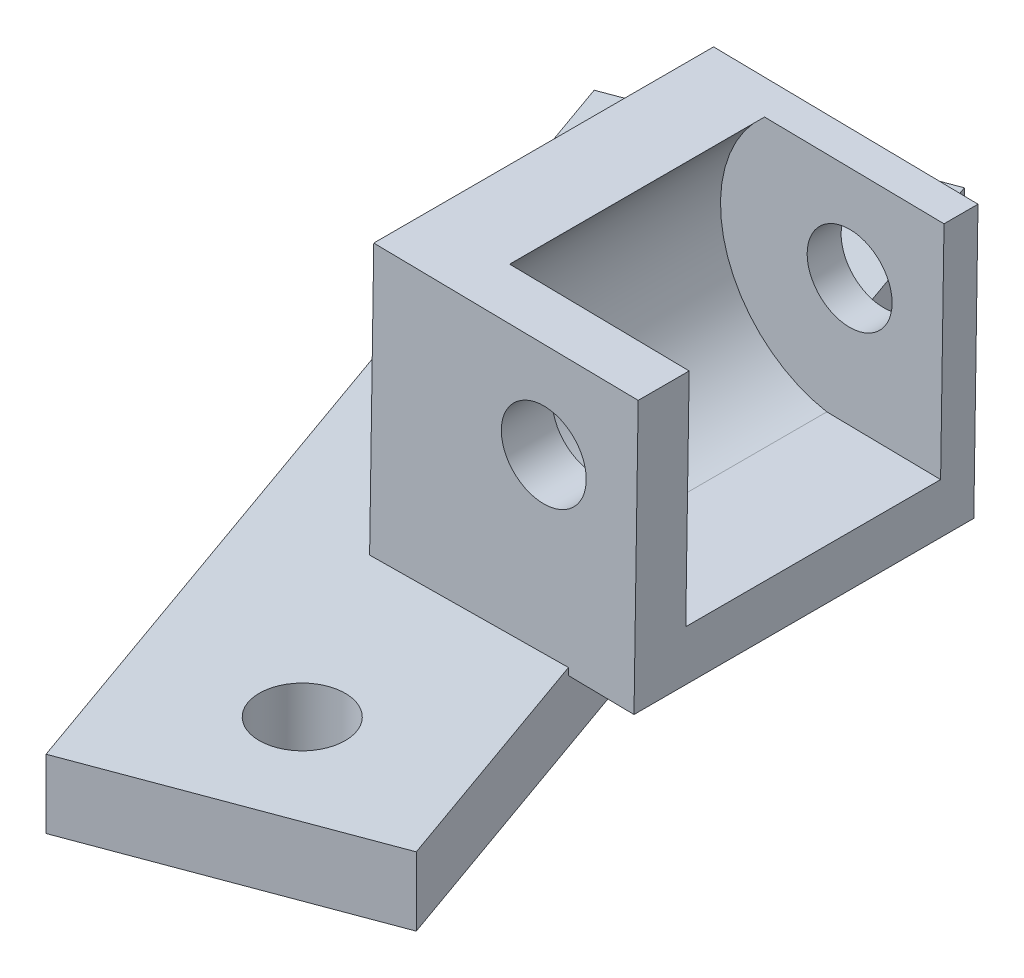
ISO-10303-21;
HEADER;
FILE_DESCRIPTION(('STEP AP214'),'2;1');
FILE_NAME('part.step','',(''),(''),'','','');
FILE_SCHEMA(('AUTOMOTIVE_DESIGN { 1 0 10303 214 1 1 1 1 }'));
ENDSEC;
DATA;
#1=APPLICATION_CONTEXT('core data for automotive mechanical design processes');
#2=APPLICATION_PROTOCOL_DEFINITION('international standard','automotive_design',2000,#1);
#3=PRODUCT_CONTEXT('',#1,'mechanical');
#4=PRODUCT('Part','Part','',(#3));
#5=PRODUCT_RELATED_PRODUCT_CATEGORY('part','',(#4));
#6=PRODUCT_DEFINITION_FORMATION('','',#4);
#7=PRODUCT_DEFINITION_CONTEXT('part definition',#1,'design');
#8=PRODUCT_DEFINITION('design','',#6,#7);
#9=PRODUCT_DEFINITION_SHAPE('','',#8);
#10=(LENGTH_UNIT() NAMED_UNIT(*) SI_UNIT(.MILLI.,.METRE.));
#11=(NAMED_UNIT(*) PLANE_ANGLE_UNIT() SI_UNIT($,.RADIAN.));
#12=(NAMED_UNIT(*) SI_UNIT($,.STERADIAN.) SOLID_ANGLE_UNIT());
#13=UNCERTAINTY_MEASURE_WITH_UNIT(LENGTH_MEASURE(1.E-05),#10,'distance_accuracy_value','');
#14=(GEOMETRIC_REPRESENTATION_CONTEXT(3) GLOBAL_UNCERTAINTY_ASSIGNED_CONTEXT((#13)) GLOBAL_UNIT_ASSIGNED_CONTEXT((#10,
#11,#12)) REPRESENTATION_CONTEXT('',''));
#15=CARTESIAN_POINT('',(0.,0.,0.));
#16=DIRECTION('',(0.,0.,1.));
#17=DIRECTION('',(1.,0.,0.));
#18=AXIS2_PLACEMENT_3D('',#15,#16,#17);
#19=CARTESIAN_POINT('',(1.23244160219368,80.7225949257512,-21.59));
#20=DIRECTION('',(0.0152658371215677,0.999883470318906,0.));
#21=DIRECTION('',(-0.999883470318906,0.0152658371215677,0.));
#22=AXIS2_PLACEMENT_3D('',#19,#20,#21);
#23=PLANE('',#22);
#24=DIRECTION('',(-0.999883470318906,0.0152658371215677,0.));
#25=VECTOR('',#24,1.);
#26=CARTESIAN_POINT('',(-621.150306901994,90.224895891791,3.81));
#27=LINE('',#26,#25);
#28=CARTESIAN_POINT('',(-621.150306901994,90.224895891791,3.81));
#29=VERTEX_POINT('',#28);
#30=CARTESIAN_POINT('',(-626.045001013298,90.2996262031534,3.81));
#31=VERTEX_POINT('',#30);
#32=EDGE_CURVE('E232',#29,#31,#27,.T.);
#33=ORIENTED_EDGE('',*,*,#32,.T.);
#34=DIRECTION('',(-0.342298929272063,0.00522608869560341,-0.939576570065551));
#35=VECTOR('',#34,1.);
#36=CARTESIAN_POINT('',(-560.699723801131,89.3019595867962,183.17629706543));
#37=LINE('',#36,#35);
#38=CARTESIAN_POINT('',(-635.298523376999,90.4409054315819,-21.59));
#39=VERTEX_POINT('',#38);
#40=EDGE_CURVE('E219',#31,#39,#37,.T.);
#41=ORIENTED_EDGE('',*,*,#40,.T.);
#42=DIRECTION('',(-0.999883470318906,0.0152658371215677,0.));
#43=VECTOR('',#42,1.);
#44=CARTESIAN_POINT('',(1.23244160219368,80.7225949257512,-21.59));
#45=LINE('',#44,#43);
#46=CARTESIAN_POINT('',(-621.150306901994,90.224895891791,-21.59));
#47=VERTEX_POINT('',#46);
#48=EDGE_CURVE('E274',#47,#39,#45,.T.);
#49=ORIENTED_EDGE('',*,*,#48,.F.);
#50=DIRECTION('',(0.,0.,1.));
#51=VECTOR('',#50,1.);
#52=CARTESIAN_POINT('',(-621.150306901994,90.224895891791,-21.59));
#53=LINE('',#52,#51);
#54=EDGE_CURVE('E287',#47,#29,#53,.T.);
#55=ORIENTED_EDGE('',*,*,#54,.T.);
#56=EDGE_LOOP('',(#33,#41,#49,#55));
#57=FACE_BOUND('',#56,.T.);
#58=ADVANCED_FACE('F56',(#57),#23,.F.);
#59=CARTESIAN_POINT('',(-627.893070479448,103.664395922966,-21.59));
#60=DIRECTION('',(0.,0.,1.));
#61=DIRECTION('',(1.,0.,0.));
#62=AXIS2_PLACEMENT_3D('',#59,#60,#61);
#63=CYLINDRICAL_SURFACE('',#62,9.65200000000006);
#64=CARTESIAN_POINT('',(-627.893070479448,103.664395922966,-19.0499999999996));
#65=DIRECTION('',(0.,0.,-1.));
#66=DIRECTION('',(-1.,0.,0.));
#67=AXIS2_PLACEMENT_3D('',#64,#65,#66);
#68=CIRCLE('',#67,9.65200000000008);
#69=CARTESIAN_POINT('',(-629.598897848948,94.164329766067,-19.0499999999997));
#70=VERTEX_POINT('',#69);
#71=CARTESIAN_POINT('',(-634.25254540357,110.925124721748,-19.0499999999998));
#72=VERTEX_POINT('',#71);
#73=EDGE_CURVE('E254',#70,#72,#68,.T.);
#74=ORIENTED_EDGE('',*,*,#73,.T.);
#75=DIRECTION('',(0.,0.,1.));
#76=VECTOR('',#75,1.);
#77=CARTESIAN_POINT('',(-634.25254540357,110.925124721748,-21.59));
#78=LINE('',#77,#76);
#79=CARTESIAN_POINT('',(-634.25254540357,110.925124721748,0.));
#80=VERTEX_POINT('',#79);
#81=EDGE_CURVE('E279',#72,#80,#78,.T.);
#82=ORIENTED_EDGE('',*,*,#81,.T.);
#83=CARTESIAN_POINT('',(-627.893070479448,103.664395922966,0.));
#84=DIRECTION('',(0.,0.,1.));
#85=DIRECTION('',(1.,0.,0.));
#86=AXIS2_PLACEMENT_3D('',#83,#84,#85);
#87=CIRCLE('',#86,9.65200000000006);
#88=CARTESIAN_POINT('',(-629.598897848948,94.164329766067,0.));
#89=VERTEX_POINT('',#88);
#90=EDGE_CURVE('E267',#80,#89,#87,.T.);
#91=ORIENTED_EDGE('',*,*,#90,.T.);
#92=DIRECTION('',(0.,0.,1.));
#93=VECTOR('',#92,1.);
#94=CARTESIAN_POINT('',(-629.598897848948,94.164329766067,-21.59));
#95=LINE('',#94,#93);
#96=EDGE_CURVE('E283',#70,#89,#95,.T.);
#97=ORIENTED_EDGE('',*,*,#96,.F.);
#98=EDGE_LOOP('',(#74,#82,#91,#97));
#99=FACE_BOUND('',#98,.T.);
#100=ADVANCED_FACE('F58',(#99),#63,.F.);
#101=CARTESIAN_POINT('',(1.29060444162685,84.5321509476663,-21.59));
#102=DIRECTION('',(0.0152658371215677,0.999883470318906,0.));
#103=DIRECTION('',(-0.999883470318906,0.0152658371215677,0.));
#104=AXIS2_PLACEMENT_3D('',#101,#102,#103);
#105=PLANE('',#104);
#106=DIRECTION('',(0.,0.,1.));
#107=VECTOR('',#106,1.);
#108=CARTESIAN_POINT('',(-621.092144062561,94.0344519137061,-21.59));
#109=LINE('',#108,#107);
#110=CARTESIAN_POINT('',(-621.092144062561,94.0344519137061,-19.0499999999996));
#111=VERTEX_POINT('',#110);
#112=CARTESIAN_POINT('',(-621.092144062561,94.0344519137061,0.));
#113=VERTEX_POINT('',#112);
#114=EDGE_CURVE('E285',#111,#113,#109,.T.);
#115=ORIENTED_EDGE('',*,*,#114,.F.);
#116=DIRECTION('',(-0.999883470318906,0.0152658371215695,0.));
#117=VECTOR('',#116,1.);
#118=CARTESIAN_POINT('',(1.29060444162699,84.5321509476652,-19.05));
#119=LINE('',#118,#117);
#120=EDGE_CURVE('E79',#111,#70,#119,.T.);
#121=ORIENTED_EDGE('',*,*,#120,.T.);
#122=ORIENTED_EDGE('',*,*,#96,.T.);
#123=DIRECTION('',(-0.999883470318906,0.0152658371215677,0.));
#124=VECTOR('',#123,1.);
#125=CARTESIAN_POINT('',(1.29060444162685,84.5321509476663,0.));
#126=LINE('',#125,#124);
#127=EDGE_CURVE('E271',#113,#89,#126,.T.);
#128=ORIENTED_EDGE('',*,*,#127,.F.);
#129=EDGE_LOOP('',(#115,#121,#122,#128));
#130=FACE_BOUND('',#129,.T.);
#131=ADVANCED_FACE('F340',(#130),#105,.T.);
#132=CARTESIAN_POINT('',(-622.382748504188,9.50230096603983,-21.59));
#133=DIRECTION('',(-0.999883470318906,0.0152658371215677,0.));
#134=DIRECTION('',(-0.0152658371215678,-0.999883470318906,0.));
#135=AXIS2_PLACEMENT_3D('',#132,#133,#134);
#136=PLANE('',#135);
#137=ORIENTED_EDGE('',*,*,#114,.T.);
#138=DIRECTION('',(-0.0152658371215623,-0.999883470318906,0.));
#139=VECTOR('',#138,1.);
#140=CARTESIAN_POINT('',(-620.837390825843,110.720307289694,0.));
#141=LINE('',#140,#139);
#142=CARTESIAN_POINT('',(-620.837390825843,110.720307289694,0.));
#143=VERTEX_POINT('',#142);
#144=EDGE_CURVE('E236',#143,#113,#141,.T.);
#145=ORIENTED_EDGE('',*,*,#144,.F.);
#146=DIRECTION('',(0.,0.,-1.));
#147=VECTOR('',#146,1.);
#148=CARTESIAN_POINT('',(-620.837390825843,110.720307289694,3.81));
#149=LINE('',#148,#147);
#150=CARTESIAN_POINT('',(-620.837390825843,110.720307289694,3.81));
#151=VERTEX_POINT('',#150);
#152=EDGE_CURVE('E244',#151,#143,#149,.T.);
#153=ORIENTED_EDGE('',*,*,#152,.F.);
#154=DIRECTION('',(-0.0152658371215623,-0.999883470318906,0.));
#155=VECTOR('',#154,1.);
#156=CARTESIAN_POINT('',(-620.837390825843,110.720307289694,3.81));
#157=LINE('',#156,#155);
#158=EDGE_CURVE('E241',#151,#29,#157,.T.);
#159=ORIENTED_EDGE('',*,*,#158,.T.);
#160=ORIENTED_EDGE('',*,*,#54,.F.);
#161=DIRECTION('',(-0.0152658371215678,-0.999883470318906,0.));
#162=VECTOR('',#161,1.);
#163=CARTESIAN_POINT('',(-622.382748504188,9.50230096603983,-21.59));
#164=LINE('',#163,#162);
#165=CARTESIAN_POINT('',(-620.837390825843,110.720307289694,-21.59));
#166=VERTEX_POINT('',#165);
#167=EDGE_CURVE('E277',#166,#47,#164,.T.);
#168=ORIENTED_EDGE('',*,*,#167,.F.);
#169=DIRECTION('',(0.,0.,1.));
#170=VECTOR('',#169,1.);
#171=CARTESIAN_POINT('',(-620.837390825843,110.720307289694,-45.3479752360297));
#172=LINE('',#171,#170);
#173=CARTESIAN_POINT('',(-620.837390825843,110.720307289694,-19.0499999999998));
#174=VERTEX_POINT('',#173);
#175=EDGE_CURVE('E262',#166,#174,#172,.T.);
#176=ORIENTED_EDGE('',*,*,#175,.T.);
#177=DIRECTION('',(0.0152658371215684,0.999883470318906,0.));
#178=VECTOR('',#177,1.);
#179=CARTESIAN_POINT('',(-622.382748504188,9.50230096604021,-19.0499999999996));
#180=LINE('',#179,#178);
#181=EDGE_CURVE('E250',#111,#174,#180,.T.);
#182=ORIENTED_EDGE('',*,*,#181,.F.);
#183=EDGE_LOOP('',(#137,#145,#153,#159,#160,#168,#176,#182));
#184=FACE_BOUND('',#183,.T.);
#185=ADVANCED_FACE('F322',(#184),#136,.F.);
#186=CARTESIAN_POINT('',(-635.371075882775,90.4420131353982,-21.5899999999999));
#187=VERTEX_POINT('',#186);
#188=CARTESIAN_POINT('',(-640.914721516246,90.5266513895672,-21.59));
#189=VERTEX_POINT('',#188);
#190=EDGE_CURVE('E273',#187,#189,#45,.T.);
#191=ORIENTED_EDGE('',*,*,#190,.F.);
#192=DIRECTION('',(-0.400047773889427,0.0061077758942189,0.916473935079302));
#193=VECTOR('',#192,1.);
#194=CARTESIAN_POINT('',(-533.46643276404,88.8861721499623,-255.044490632144));
#195=LINE('',#194,#193);
#196=CARTESIAN_POINT('',(-640.914721516246,90.5266513895672,-8.89000000001022));
#197=VERTEX_POINT('',#196);
#198=EDGE_CURVE('E213',#187,#197,#195,.T.);
#199=ORIENTED_EDGE('',*,*,#198,.T.);
#200=DIRECTION('',(0.,0.,1.));
#201=VECTOR('',#200,1.);
#202=CARTESIAN_POINT('',(-640.914721516246,90.5266513895672,-21.59));
#203=LINE('',#202,#201);
#204=EDGE_CURVE('E289',#189,#197,#203,.T.);
#205=ORIENTED_EDGE('',*,*,#204,.F.);
#206=EDGE_LOOP('',(#191,#199,#205));
#207=FACE_BOUND('',#206,.T.);
#208=ADVANCED_FACE('F310',(#207),#23,.F.);
#209=CARTESIAN_POINT('',(-642.147163118439,9.80405646381606,-21.59));
#210=DIRECTION('',(0.999883470318906,-0.0152658371215678,0.));
#211=DIRECTION('',(0.0152658371215678,0.999883470318906,0.));
#212=AXIS2_PLACEMENT_3D('',#209,#210,#211);
#213=PLANE('',#212);
#214=ORIENTED_EDGE('',*,*,#204,.T.);
#215=DIRECTION('',(0.000170947301251259,0.0111967250440051,0.999937300097016));
#216=VECTOR('',#215,1.);
#217=CARTESIAN_POINT('',(-640.917046953941,90.3743396169369,-22.4923901719979));
#218=LINE('',#217,#216);
#219=CARTESIAN_POINT('',(-640.912550349388,90.6688587140116,3.81));
#220=VERTEX_POINT('',#219);
#221=EDGE_CURVE('E207',#197,#220,#218,.T.);
#222=ORIENTED_EDGE('',*,*,#221,.T.);
#223=DIRECTION('',(0.0152658371215677,0.999883470318906,0.));
#224=VECTOR('',#223,1.);
#225=CARTESIAN_POINT('',(-640.914721516246,90.5266513895672,3.81));
#226=LINE('',#225,#224);
#227=CARTESIAN_POINT('',(-640.601805440095,111.02206278747,3.81));
#228=VERTEX_POINT('',#227);
#229=EDGE_CURVE('E235',#220,#228,#226,.T.);
#230=ORIENTED_EDGE('',*,*,#229,.T.);
#231=DIRECTION('',(0.,0.,1.));
#232=VECTOR('',#231,1.);
#233=CARTESIAN_POINT('',(-640.601805440095,111.02206278747,-21.59));
#234=LINE('',#233,#232);
#235=CARTESIAN_POINT('',(-640.601805440095,111.02206278747,-21.59));
#236=VERTEX_POINT('',#235);
#237=EDGE_CURVE('E292',#236,#228,#234,.T.);
#238=ORIENTED_EDGE('',*,*,#237,.F.);
#239=DIRECTION('',(0.0152658371215678,0.999883470318906,0.));
#240=VECTOR('',#239,1.);
#241=CARTESIAN_POINT('',(-642.147163118439,9.80405646381606,-21.59));
#242=LINE('',#241,#240);
#243=EDGE_CURVE('E270',#189,#236,#242,.T.);
#244=ORIENTED_EDGE('',*,*,#243,.F.);
#245=EDGE_LOOP('',(#214,#222,#230,#238,#244));
#246=FACE_BOUND('',#245,.T.);
#247=ADVANCED_FACE('F304',(#246),#213,.F.);
#248=CARTESIAN_POINT('',(1.54535767834408,101.218006323655,-21.59));
#249=DIRECTION('',(-0.015265837121567,-0.999883470318906,0.));
#250=DIRECTION('',(0.999883470318906,-0.015265837121567,0.));
#251=AXIS2_PLACEMENT_3D('',#248,#249,#250);
#252=PLANE('',#251);
#253=ORIENTED_EDGE('',*,*,#237,.T.);
#254=DIRECTION('',(0.999883470318906,-0.0152658371215671,0.));
#255=VECTOR('',#254,1.);
#256=CARTESIAN_POINT('',(-640.601805440095,111.02206278747,3.81));
#257=LINE('',#256,#255);
#258=EDGE_CURVE('E238',#228,#151,#257,.T.);
#259=ORIENTED_EDGE('',*,*,#258,.T.);
#260=ORIENTED_EDGE('',*,*,#152,.T.);
#261=DIRECTION('',(0.999883470318906,-0.0152658371215671,0.));
#262=VECTOR('',#261,1.);
#263=CARTESIAN_POINT('',(-640.601805440095,111.02206278747,0.));
#264=LINE('',#263,#262);
#265=EDGE_CURVE('E229',#80,#143,#264,.T.);
#266=ORIENTED_EDGE('',*,*,#265,.F.);
#267=ORIENTED_EDGE('',*,*,#81,.F.);
#268=DIRECTION('',(0.999883470318906,-0.0152658371215682,0.));
#269=VECTOR('',#268,1.);
#270=CARTESIAN_POINT('',(1.54535767834418,101.218006323654,-19.0499999999998));
#271=LINE('',#270,#269);
#272=EDGE_CURVE('E256',#72,#174,#271,.T.);
#273=ORIENTED_EDGE('',*,*,#272,.T.);
#274=ORIENTED_EDGE('',*,*,#175,.F.);
#275=DIRECTION('',(0.999883470318906,-0.015265837121567,0.));
#276=VECTOR('',#275,1.);
#277=CARTESIAN_POINT('',(1.54535767834408,101.218006323655,-21.59));
#278=LINE('',#277,#276);
#279=EDGE_CURVE('E268',#236,#166,#278,.T.);
#280=ORIENTED_EDGE('',*,*,#279,.F.);
#281=EDGE_LOOP('',(#253,#259,#260,#266,#267,#273,#274,#280));
#282=FACE_BOUND('',#281,.T.);
#283=ADVANCED_FACE('F327',(#282),#252,.F.);
#284=CARTESIAN_POINT('',(0.,0.,-21.59));
#285=DIRECTION('',(0.,0.,1.));
#286=DIRECTION('',(1.,0.,0.));
#287=AXIS2_PLACEMENT_3D('',#284,#285,#286);
#288=PLANE('',#287);
#289=ORIENTED_EDGE('',*,*,#48,.T.);
#290=DIRECTION('',(-0.00630218747604839,0.999980141019319,0.));
#291=VECTOR('',#290,1.);
#292=CARTESIAN_POINT('',(-634.703326642942,-4.00009879406007,-21.59));
#293=LINE('',#292,#291);
#294=CARTESIAN_POINT('',(-635.298535103855,90.4427661543582,-21.59));
#295=VERTEX_POINT('',#294);
#296=EDGE_CURVE('E222',#39,#295,#293,.T.);
#297=ORIENTED_EDGE('',*,*,#296,.T.);
#298=DIRECTION('',(-0.999946125618088,-0.0103800703935442,0.));
#299=VECTOR('',#298,1.);
#300=CARTESIAN_POINT('',(-1.00720248977156,97.0271095643389,-21.59));
#301=LINE('',#300,#299);
#302=EDGE_CURVE('E216',#295,#187,#301,.T.);
#303=ORIENTED_EDGE('',*,*,#302,.T.);
#304=ORIENTED_EDGE('',*,*,#190,.T.);
#305=ORIENTED_EDGE('',*,*,#243,.T.);
#306=ORIENTED_EDGE('',*,*,#279,.T.);
#307=ORIENTED_EDGE('',*,*,#167,.T.);
#308=EDGE_LOOP('',(#289,#297,#303,#304,#305,#306,#307));
#309=FACE_BOUND('',#308,.T.);
#310=CARTESIAN_POINT('',(-627.893070479448,103.664395922966,-21.59));
#311=DIRECTION('',(0.,0.,1.));
#312=DIRECTION('',(1.,0.,0.));
#313=AXIS2_PLACEMENT_3D('',#310,#311,#312);
#314=CIRCLE('',#313,3.17500000000009);
#315=CARTESIAN_POINT('',(-624.718070479448,103.664395922966,-21.59));
#316=VERTEX_POINT('',#315);
#317=EDGE_CURVE('E264',#316,#316,#314,.F.);
#318=ORIENTED_EDGE('',*,*,#317,.F.);
#319=EDGE_LOOP('',(#318));
#320=FACE_BOUND('',#319,.T.);
#321=ADVANCED_FACE('F313',(#309,#320),#288,.F.);
#322=CARTESIAN_POINT('',(1.11022302462516E-13,0.,-19.0499999999998));
#323=DIRECTION('',(0.,0.,-1.));
#324=DIRECTION('',(-1.,0.,0.));
#325=AXIS2_PLACEMENT_3D('',#322,#323,#324);
#326=PLANE('',#325);
#327=ORIENTED_EDGE('',*,*,#181,.T.);
#328=ORIENTED_EDGE('',*,*,#272,.F.);
#329=ORIENTED_EDGE('',*,*,#73,.F.);
#330=ORIENTED_EDGE('',*,*,#120,.F.);
#331=EDGE_LOOP('',(#327,#328,#329,#330));
#332=FACE_BOUND('',#331,.T.);
#333=CARTESIAN_POINT('',(-627.893070479448,103.664395922966,-19.0499999999996));
#334=DIRECTION('',(0.,0.,-1.));
#335=DIRECTION('',(-1.,0.,0.));
#336=AXIS2_PLACEMENT_3D('',#333,#334,#335);
#337=CIRCLE('',#336,3.17500000000009);
#338=CARTESIAN_POINT('',(-631.068070479448,103.664395922966,-19.0499999999996));
#339=VERTEX_POINT('',#338);
#340=EDGE_CURVE('E259',#339,#339,#337,.F.);
#341=ORIENTED_EDGE('',*,*,#340,.F.);
#342=EDGE_LOOP('',(#341));
#343=FACE_BOUND('',#342,.T.);
#344=ADVANCED_FACE('F335',(#332,#343),#326,.F.);
#345=CARTESIAN_POINT('',(-627.893070479448,103.664395922966,-45.3479752360294));
#346=DIRECTION('',(0.,0.,1.));
#347=DIRECTION('',(1.,0.,0.));
#348=AXIS2_PLACEMENT_3D('',#345,#346,#347);
#349=CYLINDRICAL_SURFACE('',#348,3.17500000000009);
#350=ORIENTED_EDGE('',*,*,#317,.T.);
#351=EDGE_LOOP('',(#350));
#352=FACE_BOUND('',#351,.T.);
#353=ORIENTED_EDGE('',*,*,#340,.T.);
#354=EDGE_LOOP('',(#353));
#355=FACE_BOUND('',#354,.T.);
#356=ADVANCED_FACE('F344',(#352,#355),#349,.F.);
#357=CARTESIAN_POINT('',(0.,0.,0.));
#358=DIRECTION('',(0.,0.,-1.));
#359=DIRECTION('',(-1.,0.,0.));
#360=AXIS2_PLACEMENT_3D('',#357,#358,#359);
#361=PLANE('',#360);
#362=CARTESIAN_POINT('',(-627.893070479448,103.664395922966,0.));
#363=DIRECTION('',(0.,0.,1.));
#364=DIRECTION('',(1.,0.,0.));
#365=AXIS2_PLACEMENT_3D('',#362,#363,#364);
#366=CIRCLE('',#365,3.17500000000008);
#367=CARTESIAN_POINT('',(-631.068070479448,103.664395922966,0.));
#368=VERTEX_POINT('',#367);
#369=EDGE_CURVE('E225',#368,#368,#366,.T.);
#370=ORIENTED_EDGE('',*,*,#369,.T.);
#371=EDGE_LOOP('',(#370));
#372=FACE_BOUND('',#371,.T.);
#373=ORIENTED_EDGE('',*,*,#90,.F.);
#374=ORIENTED_EDGE('',*,*,#265,.T.);
#375=ORIENTED_EDGE('',*,*,#144,.T.);
#376=ORIENTED_EDGE('',*,*,#127,.T.);
#377=EDGE_LOOP('',(#373,#374,#375,#376));
#378=FACE_BOUND('',#377,.T.);
#379=ADVANCED_FACE('F342',(#372,#378),#361,.T.);
#380=CARTESIAN_POINT('',(0.,0.,3.81));
#381=DIRECTION('',(0.,0.,-1.));
#382=DIRECTION('',(-1.,0.,0.));
#383=AXIS2_PLACEMENT_3D('',#380,#381,#382);
#384=PLANE('',#383);
#385=DIRECTION('',(0.999946125618088,0.0103800703935442,0.));
#386=VECTOR('',#385,1.);
#387=CARTESIAN_POINT('',(-1.01015410692917,97.3114484974249,3.81));
#388=LINE('',#387,#386);
#389=CARTESIAN_POINT('',(-626.048300480575,90.823158986829,3.81000000000002));
#390=VERTEX_POINT('',#389);
#391=EDGE_CURVE('E64',#220,#390,#388,.T.);
#392=ORIENTED_EDGE('',*,*,#391,.T.);
#393=DIRECTION('',(0.00630218747604839,-0.999980141019319,0.));
#394=VECTOR('',#393,1.);
#395=CARTESIAN_POINT('',(-625.451062157138,-3.94178813070222,3.81));
#396=LINE('',#395,#394);
#397=EDGE_CURVE('E12',#390,#31,#396,.T.);
#398=ORIENTED_EDGE('',*,*,#397,.T.);
#399=ORIENTED_EDGE('',*,*,#32,.F.);
#400=ORIENTED_EDGE('',*,*,#158,.F.);
#401=ORIENTED_EDGE('',*,*,#258,.F.);
#402=ORIENTED_EDGE('',*,*,#229,.F.);
#403=EDGE_LOOP('',(#392,#398,#399,#400,#401,#402));
#404=FACE_BOUND('',#403,.T.);
#405=CARTESIAN_POINT('',(-627.893070479448,103.664395922966,3.81));
#406=DIRECTION('',(0.,0.,1.));
#407=DIRECTION('',(1.,0.,0.));
#408=AXIS2_PLACEMENT_3D('',#405,#406,#407);
#409=CIRCLE('',#408,3.17500000000008);
#410=CARTESIAN_POINT('',(-631.068070479448,103.664395922966,3.81));
#411=VERTEX_POINT('',#410);
#412=EDGE_CURVE('E226',#411,#411,#409,.T.);
#413=ORIENTED_EDGE('',*,*,#412,.F.);
#414=EDGE_LOOP('',(#413));
#415=FACE_BOUND('',#414,.T.);
#416=ADVANCED_FACE('F298',(#404,#415),#384,.F.);
#417=CARTESIAN_POINT('',(-627.893070479448,103.664395922966,3.81));
#418=DIRECTION('',(0.,0.,-1.));
#419=DIRECTION('',(-1.,0.,0.));
#420=AXIS2_PLACEMENT_3D('',#417,#418,#419);
#421=CYLINDRICAL_SURFACE('',#420,3.17500000000008);
#422=CARTESIAN_POINT('',(-631.068070479448,103.664395922966,3.81));
#423=CARTESIAN_POINT('',(-631.068070479448,103.664395922966,3.7703125));
#424=CARTESIAN_POINT('',(-631.068070479448,103.664395922966,3.730625));
#425=CARTESIAN_POINT('',(-631.068070479448,103.664395922966,3.65125));
#426=CARTESIAN_POINT('',(-631.068070479448,103.664395922966,3.6115625));
#427=CARTESIAN_POINT('',(-631.068070479448,103.664395922966,3.5321875));
#428=CARTESIAN_POINT('',(-631.068070479448,103.664395922966,3.4925));
#429=CARTESIAN_POINT('',(-631.068070479448,103.664395922966,3.413125));
#430=CARTESIAN_POINT('',(-631.068070479448,103.664395922966,3.3734375));
#431=CARTESIAN_POINT('',(-631.068070479448,103.664395922966,3.2940625));
#432=CARTESIAN_POINT('',(-631.068070479448,103.664395922966,3.254375));
#433=CARTESIAN_POINT('',(-631.068070479448,103.664395922966,3.175));
#434=CARTESIAN_POINT('',(-631.068070479448,103.664395922966,3.1353125));
#435=CARTESIAN_POINT('',(-631.068070479448,103.664395922966,3.0559375));
#436=CARTESIAN_POINT('',(-631.068070479448,103.664395922966,3.01625));
#437=CARTESIAN_POINT('',(-631.068070479448,103.664395922966,2.936875));
#438=CARTESIAN_POINT('',(-631.068070479448,103.664395922966,2.8971875));
#439=CARTESIAN_POINT('',(-631.068070479448,103.664395922966,2.8178125));
#440=CARTESIAN_POINT('',(-631.068070479448,103.664395922966,2.778125));
#441=CARTESIAN_POINT('',(-631.068070479448,103.664395922966,2.69875));
#442=CARTESIAN_POINT('',(-631.068070479448,103.664395922966,2.6590625));
#443=CARTESIAN_POINT('',(-631.068070479448,103.664395922966,2.5796875));
#444=CARTESIAN_POINT('',(-631.068070479448,103.664395922966,2.54));
#445=CARTESIAN_POINT('',(-631.068070479448,103.664395922966,2.460625));
#446=CARTESIAN_POINT('',(-631.068070479448,103.664395922966,2.4209375));
#447=CARTESIAN_POINT('',(-631.068070479448,103.664395922966,2.3415625));
#448=CARTESIAN_POINT('',(-631.068070479448,103.664395922966,2.301875));
#449=CARTESIAN_POINT('',(-631.068070479448,103.664395922966,2.2225));
#450=CARTESIAN_POINT('',(-631.068070479448,103.664395922966,2.1828125));
#451=CARTESIAN_POINT('',(-631.068070479448,103.664395922966,2.1034375));
#452=CARTESIAN_POINT('',(-631.068070479448,103.664395922966,2.06375));
#453=CARTESIAN_POINT('',(-631.068070479448,103.664395922966,1.984375));
#454=CARTESIAN_POINT('',(-631.068070479448,103.664395922966,1.9446875));
#455=CARTESIAN_POINT('',(-631.068070479448,103.664395922966,1.8653125));
#456=CARTESIAN_POINT('',(-631.068070479448,103.664395922966,1.825625));
#457=CARTESIAN_POINT('',(-631.068070479448,103.664395922966,1.74625));
#458=CARTESIAN_POINT('',(-631.068070479448,103.664395922966,1.7065625));
#459=CARTESIAN_POINT('',(-631.068070479448,103.664395922966,1.6271875));
#460=CARTESIAN_POINT('',(-631.068070479448,103.664395922966,1.5875));
#461=CARTESIAN_POINT('',(-631.068070479448,103.664395922966,1.508125));
#462=CARTESIAN_POINT('',(-631.068070479448,103.664395922966,1.4684375));
#463=CARTESIAN_POINT('',(-631.068070479448,103.664395922966,1.3890625));
#464=CARTESIAN_POINT('',(-631.068070479448,103.664395922966,1.349375));
#465=CARTESIAN_POINT('',(-631.068070479448,103.664395922966,1.27));
#466=CARTESIAN_POINT('',(-631.068070479448,103.664395922966,1.2303125));
#467=CARTESIAN_POINT('',(-631.068070479448,103.664395922966,1.1509375));
#468=CARTESIAN_POINT('',(-631.068070479448,103.664395922966,1.11125));
#469=CARTESIAN_POINT('',(-631.068070479448,103.664395922966,1.031875));
#470=CARTESIAN_POINT('',(-631.068070479448,103.664395922966,0.9921875));
#471=CARTESIAN_POINT('',(-631.068070479448,103.664395922966,0.9128125));
#472=CARTESIAN_POINT('',(-631.068070479448,103.664395922966,0.873125));
#473=CARTESIAN_POINT('',(-631.068070479448,103.664395922966,0.79375));
#474=CARTESIAN_POINT('',(-631.068070479448,103.664395922966,0.7540625));
#475=CARTESIAN_POINT('',(-631.068070479448,103.664395922966,0.6746875));
#476=CARTESIAN_POINT('',(-631.068070479448,103.664395922966,0.635));
#477=CARTESIAN_POINT('',(-631.068070479448,103.664395922966,0.555625));
#478=CARTESIAN_POINT('',(-631.068070479448,103.664395922966,0.5159375));
#479=CARTESIAN_POINT('',(-631.068070479448,103.664395922966,0.4365625));
#480=CARTESIAN_POINT('',(-631.068070479448,103.664395922966,0.396875));
#481=CARTESIAN_POINT('',(-631.068070479448,103.664395922966,0.3175));
#482=CARTESIAN_POINT('',(-631.068070479448,103.664395922966,0.2778125));
#483=CARTESIAN_POINT('',(-631.068070479448,103.664395922966,0.1984375));
#484=CARTESIAN_POINT('',(-631.068070479448,103.664395922966,0.15875));
#485=CARTESIAN_POINT('',(-631.068070479448,103.664395922966,0.0793749999999999));
#486=CARTESIAN_POINT('',(-631.068070479448,103.664395922966,0.0396874999999999));
#487=CARTESIAN_POINT('',(-631.068070479448,103.664395922966,0.));
#488=B_SPLINE_CURVE_WITH_KNOTS('',3,(#422,#423,#424,#425,#426,#427,#428,#429,#430,#431,#432,
#433,#434,#435,#436,#437,#438,#439,#440,#441,#442,#443,#444,#445,#446,#447,#448,#449,#450,#451,
#452,#453,#454,#455,#456,#457,#458,#459,#460,#461,#462,#463,#464,#465,#466,#467,#468,#469,#470,
#471,#472,#473,#474,#475,#476,#477,#478,#479,#480,#481,#482,#483,#484,#485,#486,#487),
.UNSPECIFIED.,.F.,.F.,(4,2,2,2,2,2,2,2,2,2,2,2,2,2,2,2,2,2,2,2,2,2,2,2,2,2,2,2,2,2,2,2,4),(0.,
0.1190625,0.238125,0.3571875,0.47625,0.595312499999999,0.714375,0.833437499999999,
0.952499999999999,1.0715625,1.190625,1.3096875,1.42875,1.5478125,1.666875,1.7859375,1.905,
2.0240625,2.143125,2.2621875,2.38125,2.5003125,2.619375,2.7384375,2.8575,2.9765625,3.095625,
3.2146875,3.33375,3.4528125,3.571875,3.6909375,3.81),.UNSPECIFIED.);
#489=EDGE_CURVE('BSEAM352',#411,#368,#488,.T.);
#490=ORIENTED_EDGE('',*,*,#412,.T.);
#491=ORIENTED_EDGE('',*,*,#369,.F.);
#492=ORIENTED_EDGE('',*,*,#489,.T.);
#493=ORIENTED_EDGE('',*,*,#489,.F.);
#494=EDGE_LOOP('',(#490,#492,#491,#493));
#495=FACE_BOUND('',#494,.T.);
#496=ADVANCED_FACE('F352',(#495),#421,.F.);
#497=CARTESIAN_POINT('',(-619.481110339117,86.0116419911658,21.7547759738353));
#498=DIRECTION('',(0.939583520619461,0.00592154909227845,-0.342268524753133));
#499=DIRECTION('',(-0.34227452568999,0.,-0.939599994180339));
#500=AXIS2_PLACEMENT_3D('',#497,#498,#499);
#501=PLANE('',#500);
#502=ORIENTED_EDGE('',*,*,#296,.F.);
#503=ORIENTED_EDGE('',*,*,#40,.F.);
#504=ORIENTED_EDGE('',*,*,#397,.F.);
#505=DIRECTION('',(-0.342162352430782,-0.0140705735266898,-0.939535493496474));
#506=VECTOR('',#505,1.);
#507=CARTESIAN_POINT('',(-619.533837792677,91.0910500203859,21.6979086867883));
#508=LINE('',#507,#506);
#509=CARTESIAN_POINT('',(-619.533837792677,91.0910500203859,21.6979086867883));
#510=VERTEX_POINT('',#509);
#511=EDGE_CURVE('E71',#510,#390,#508,.T.);
#512=ORIENTED_EDGE('',*,*,#511,.F.);
#513=DIRECTION('',(-0.0103794199920881,0.999883470318906,-0.011194347843894));
#514=VECTOR('',#513,1.);
#515=CARTESIAN_POINT('',(-619.481110339117,86.0116419911658,21.7547759738353));
#516=LINE('',#515,#514);
#517=CARTESIAN_POINT('',(-619.481110339117,86.0116419911658,21.7547759738353));
#518=VERTEX_POINT('',#517);
#519=EDGE_CURVE('E208',#518,#510,#516,.T.);
#520=ORIENTED_EDGE('',*,*,#519,.F.);
#521=DIRECTION('',(-0.342162352430782,-0.0140705735266898,-0.939535493496474));
#522=VECTOR('',#521,1.);
#523=CARTESIAN_POINT('',(-619.481110339117,86.0116419911658,21.7547759738353));
#524=LINE('',#523,#522);
#525=CARTESIAN_POINT('',(-642.94660446882,85.0466820587054,-42.678568170153));
#526=VERTEX_POINT('',#525);
#527=EDGE_CURVE('E176',#518,#526,#524,.T.);
#528=ORIENTED_EDGE('',*,*,#527,.T.);
#529=DIRECTION('',(-0.0103794199920881,0.999883470318906,-0.011194347843894));
#530=VECTOR('',#529,1.);
#531=CARTESIAN_POINT('',(-642.94660446882,85.0466820587054,-42.678568170153));
#532=LINE('',#531,#530);
#533=CARTESIAN_POINT('',(-642.99933192238,90.1260900879255,-42.7354354571999));
#534=VERTEX_POINT('',#533);
#535=EDGE_CURVE('E190',#526,#534,#532,.T.);
#536=ORIENTED_EDGE('',*,*,#535,.T.);
#537=EDGE_CURVE('E192',#295,#534,#508,.T.);
#538=ORIENTED_EDGE('',*,*,#537,.F.);
#539=EDGE_LOOP('',(#502,#503,#504,#512,#520,#528,#536,#538));
#540=FACE_BOUND('',#539,.T.);
#541=ADVANCED_FACE('F317',(#540),#501,.T.);
#542=CARTESIAN_POINT('',(-1.00958483396756,97.2566085714132,-1.08885118994777));
#543=DIRECTION('',(-0.0103794199920882,0.999883470318906,-0.011194347843894));
#544=DIRECTION('',(0.,0.0111949508893725,0.999937334573815));
#545=AXIS2_PLACEMENT_3D('',#542,#543,#544);
#546=PLANE('',#545);
#547=CARTESIAN_POINT('',(-650.100312714358,90.1872543641266,-30.6881761953062));
#548=DIRECTION('',(-0.0103794199920881,0.999883470318906,-0.011194347843894));
#549=DIRECTION('',(0.,0.0111949508893725,0.999937334573814));
#550=AXIS2_PLACEMENT_3D('',#547,#548,#549);
#551=CIRCLE('',#550,3.1750000000001);
#552=CARTESIAN_POINT('',(-650.100312714358,90.2227983332003,-27.5133751580342));
#553=VERTEX_POINT('',#552);
#554=EDGE_CURVE('E195',#553,#553,#551,.T.);
#555=ORIENTED_EDGE('',*,*,#554,.F.);
#556=EDGE_LOOP('',(#555));
#557=FACE_BOUND('',#556,.T.);
#558=CARTESIAN_POINT('',(-632.718465210874,90.9020394992824,17.0402268743147));
#559=DIRECTION('',(-0.0103794199920881,0.999883470318906,-0.011194347843894));
#560=DIRECTION('',(0.,0.0111949508893725,0.999937334573814));
#561=AXIS2_PLACEMENT_3D('',#558,#559,#560);
#562=CIRCLE('',#561,3.1750000000001);
#563=CARTESIAN_POINT('',(-632.718465210874,90.9375834683562,20.2150279115867));
#564=VERTEX_POINT('',#563);
#565=EDGE_CURVE('E552',#564,#564,#562,.T.);
#566=ORIENTED_EDGE('',*,*,#565,.F.);
#567=EDGE_LOOP('',(#566));
#568=FACE_BOUND('',#567,.T.);
#569=ORIENTED_EDGE('',*,*,#302,.F.);
#570=ORIENTED_EDGE('',*,*,#537,.T.);
#571=DIRECTION('',(-0.939583520619461,-0.00592154909227853,0.342268524753134));
#572=VECTOR('',#571,1.);
#573=CARTESIAN_POINT('',(-642.99933192238,90.1260900879255,-42.7354354571999));
#574=LINE('',#573,#572);
#575=CARTESIAN_POINT('',(-663.284940132554,89.9982438430232,-35.3458580077797));
#576=VERTEX_POINT('',#575);
#577=EDGE_CURVE('E200',#534,#576,#574,.T.);
#578=ORIENTED_EDGE('',*,*,#577,.T.);
#579=DIRECTION('',(0.342162352430782,0.01407057352669,0.939535493496474));
#580=VECTOR('',#579,1.);
#581=CARTESIAN_POINT('',(-663.284940132554,89.9982438430232,-35.3458580077797));
#582=LINE('',#581,#580);
#583=CARTESIAN_POINT('',(-639.819446002851,90.9632037754836,29.0874861362085));
#584=VERTEX_POINT('',#583);
#585=EDGE_CURVE('E170',#576,#584,#582,.T.);
#586=ORIENTED_EDGE('',*,*,#585,.T.);
#587=DIRECTION('',(0.939583520619461,0.00592154909227789,-0.342268524753134));
#588=VECTOR('',#587,1.);
#589=CARTESIAN_POINT('',(-639.819446002851,90.9632037754836,29.0874861362085));
#590=LINE('',#589,#588);
#591=EDGE_CURVE('E204',#584,#510,#590,.T.);
#592=ORIENTED_EDGE('',*,*,#591,.T.);
#593=ORIENTED_EDGE('',*,*,#511,.T.);
#594=ORIENTED_EDGE('',*,*,#391,.F.);
#595=ORIENTED_EDGE('',*,*,#221,.F.);
#596=ORIENTED_EDGE('',*,*,#198,.F.);
#597=EDGE_LOOP('',(#569,#570,#578,#586,#592,#593,#594,#595,#596));
#598=FACE_BOUND('',#597,.T.);
#599=ADVANCED_FACE('F302',(#557,#568,#598),#546,.T.);
#600=CARTESIAN_POINT('',(-642.94660446882,85.0466820587054,-42.678568170153));
#601=DIRECTION('',(-0.342162352430782,-0.0140705735266899,-0.939535493496474));
#602=DIRECTION('',(-0.939628512415452,0.,0.342196228290032));
#603=AXIS2_PLACEMENT_3D('',#600,#601,#602);
#604=PLANE('',#603);
#605=ORIENTED_EDGE('',*,*,#577,.F.);
#606=ORIENTED_EDGE('',*,*,#535,.F.);
#607=DIRECTION('',(-0.939583520619461,-0.00592154909227853,0.342268524753134));
#608=VECTOR('',#607,1.);
#609=CARTESIAN_POINT('',(-642.94660446882,85.0466820587054,-42.678568170153));
#610=LINE('',#609,#608);
#611=CARTESIAN_POINT('',(-663.232212678995,84.9188358138031,-35.2889907207328));
#612=VERTEX_POINT('',#611);
#613=EDGE_CURVE('E183',#526,#612,#610,.T.);
#614=ORIENTED_EDGE('',*,*,#613,.T.);
#615=DIRECTION('',(-0.0103794199920881,0.999883470318906,-0.011194347843894));
#616=VECTOR('',#615,1.);
#617=CARTESIAN_POINT('',(-663.232212678995,84.9188358138031,-35.2889907207328));
#618=LINE('',#617,#616);
#619=EDGE_CURVE('E165',#612,#576,#618,.T.);
#620=ORIENTED_EDGE('',*,*,#619,.T.);
#621=EDGE_LOOP('',(#605,#606,#614,#620));
#622=FACE_BOUND('',#621,.T.);
#623=ADVANCED_FACE('F188',(#622),#604,.T.);
#624=CARTESIAN_POINT('',(-639.766718549292,85.8837957462635,29.1443534232554));
#625=DIRECTION('',(0.342162352430782,0.0140705735266899,0.939535493496474));
#626=DIRECTION('',(0.939628512415453,0.,-0.342196228290032));
#627=AXIS2_PLACEMENT_3D('',#624,#625,#626);
#628=PLANE('',#627);
#629=ORIENTED_EDGE('',*,*,#591,.F.);
#630=DIRECTION('',(-0.0103794199920881,0.999883470318906,-0.011194347843894));
#631=VECTOR('',#630,1.);
#632=CARTESIAN_POINT('',(-639.766718549292,85.8837957462635,29.1443534232554));
#633=LINE('',#632,#631);
#634=CARTESIAN_POINT('',(-639.766718549292,85.8837957462635,29.1443534232554));
#635=VERTEX_POINT('',#634);
#636=EDGE_CURVE('E175',#635,#584,#633,.T.);
#637=ORIENTED_EDGE('',*,*,#636,.F.);
#638=DIRECTION('',(0.939583520619461,0.00592154909227789,-0.342268524753134));
#639=VECTOR('',#638,1.);
#640=CARTESIAN_POINT('',(-639.766718549292,85.8837957462635,29.1443534232554));
#641=LINE('',#640,#639);
#642=EDGE_CURVE('E186',#635,#518,#641,.T.);
#643=ORIENTED_EDGE('',*,*,#642,.T.);
#644=ORIENTED_EDGE('',*,*,#519,.T.);
#645=EDGE_LOOP('',(#629,#637,#643,#644));
#646=FACE_BOUND('',#645,.T.);
#647=ADVANCED_FACE('F493',(#646),#628,.T.);
#648=CARTESIAN_POINT('',(-663.232212678995,84.9188358138031,-35.2889907207328));
#649=DIRECTION('',(-0.939583520619461,-0.00592154909227845,0.342268524753133));
#650=DIRECTION('',(0.34227452568999,0.,0.939599994180339));
#651=AXIS2_PLACEMENT_3D('',#648,#649,#650);
#652=PLANE('',#651);
#653=ORIENTED_EDGE('',*,*,#585,.F.);
#654=ORIENTED_EDGE('',*,*,#619,.F.);
#655=DIRECTION('',(0.342162352430782,0.01407057352669,0.939535493496474));
#656=VECTOR('',#655,1.);
#657=CARTESIAN_POINT('',(-663.232212678995,84.9188358138031,-35.2889907207328));
#658=LINE('',#657,#656);
#659=EDGE_CURVE('E168',#612,#635,#658,.T.);
#660=ORIENTED_EDGE('',*,*,#659,.T.);
#661=ORIENTED_EDGE('',*,*,#636,.T.);
#662=EDGE_LOOP('',(#653,#654,#660,#661));
#663=FACE_BOUND('',#662,.T.);
#664=ADVANCED_FACE('F167',(#663),#652,.T.);
#665=CARTESIAN_POINT('',(-0.956857380407755,92.1772005421932,-1.03198390290079));
#666=DIRECTION('',(-0.0103794199920882,0.999883470318906,-0.011194347843894));
#667=DIRECTION('',(0.,0.0111949508893725,0.999937334573815));
#668=AXIS2_PLACEMENT_3D('',#665,#666,#667);
#669=PLANE('',#668);
#670=CARTESIAN_POINT('',(-632.665737757314,85.8226314700624,17.0970941613617));
#671=DIRECTION('',(-0.0103794199920881,0.999883470318906,-0.011194347843894));
#672=DIRECTION('',(0.,0.0111949508893725,0.999937334573814));
#673=AXIS2_PLACEMENT_3D('',#670,#671,#672);
#674=CIRCLE('',#673,3.1750000000001);
#675=CARTESIAN_POINT('',(-632.665737757314,85.8581754391362,20.2718951986337));
#676=VERTEX_POINT('',#675);
#677=EDGE_CURVE('E549',#676,#676,#674,.T.);
#678=ORIENTED_EDGE('',*,*,#677,.T.);
#679=EDGE_LOOP('',(#678));
#680=FACE_BOUND('',#679,.T.);
#681=CARTESIAN_POINT('',(-650.047585260798,85.1078463349066,-30.6313089082592));
#682=DIRECTION('',(-0.0103794199920881,0.999883470318906,-0.011194347843894));
#683=DIRECTION('',(0.,0.0111949508893725,0.999937334573814));
#684=AXIS2_PLACEMENT_3D('',#681,#682,#683);
#685=CIRCLE('',#684,3.1750000000001);
#686=CARTESIAN_POINT('',(-650.047585260798,85.1433903039803,-27.4565078709872));
#687=VERTEX_POINT('',#686);
#688=EDGE_CURVE('E202',#687,#687,#685,.T.);
#689=ORIENTED_EDGE('',*,*,#688,.T.);
#690=EDGE_LOOP('',(#689));
#691=FACE_BOUND('',#690,.T.);
#692=ORIENTED_EDGE('',*,*,#613,.F.);
#693=ORIENTED_EDGE('',*,*,#527,.F.);
#694=ORIENTED_EDGE('',*,*,#642,.F.);
#695=ORIENTED_EDGE('',*,*,#659,.F.);
#696=EDGE_LOOP('',(#692,#693,#694,#695));
#697=FACE_BOUND('',#696,.T.);
#698=ADVANCED_FACE('F181',(#680,#691,#697),#669,.F.);
#699=CARTESIAN_POINT('',(-650.047585260798,85.1078463349066,-30.6313089082592));
#700=DIRECTION('',(-0.0103794199920881,0.999883470318906,-0.011194347843894));
#701=DIRECTION('',(0.,0.0111949508893725,0.999937334573815));
#702=AXIS2_PLACEMENT_3D('',#699,#700,#701);
#703=CYLINDRICAL_SURFACE('',#702,3.1750000000001);
#704=ORIENTED_EDGE('',*,*,#688,.F.);
#705=EDGE_LOOP('',(#704));
#706=FACE_BOUND('',#705,.T.);
#707=ORIENTED_EDGE('',*,*,#554,.T.);
#708=EDGE_LOOP('',(#707));
#709=FACE_BOUND('',#708,.T.);
#710=ADVANCED_FACE('F516',(#706,#709),#703,.F.);
#711=CARTESIAN_POINT('',(-632.665737757314,85.8226314700624,17.0970941613617));
#712=DIRECTION('',(-0.0103794199920881,0.999883470318906,-0.011194347843894));
#713=DIRECTION('',(0.,0.0111949508893725,0.999937334573815));
#714=AXIS2_PLACEMENT_3D('',#711,#712,#713);
#715=CYLINDRICAL_SURFACE('',#714,3.1750000000001);
#716=ORIENTED_EDGE('',*,*,#677,.F.);
#717=EDGE_LOOP('',(#716));
#718=FACE_BOUND('',#717,.T.);
#719=ORIENTED_EDGE('',*,*,#565,.T.);
#720=EDGE_LOOP('',(#719));
#721=FACE_BOUND('',#720,.T.);
#722=ADVANCED_FACE('F525',(#718,#721),#715,.F.);
#723=CLOSED_SHELL('',(#58,#100,#131,#185,#208,#247,#283,#321,#344,#356,#379,#416,#496,#541,#599,
#623,#647,#664,#698,#710,#722));
#724=MANIFOLD_SOLID_BREP('B2',#723);
#725=ADVANCED_BREP_SHAPE_REPRESENTATION('',(#18,#724),#14);
#726=SHAPE_DEFINITION_REPRESENTATION(#9,#725);
ENDSEC;
END-ISO-10303-21;
